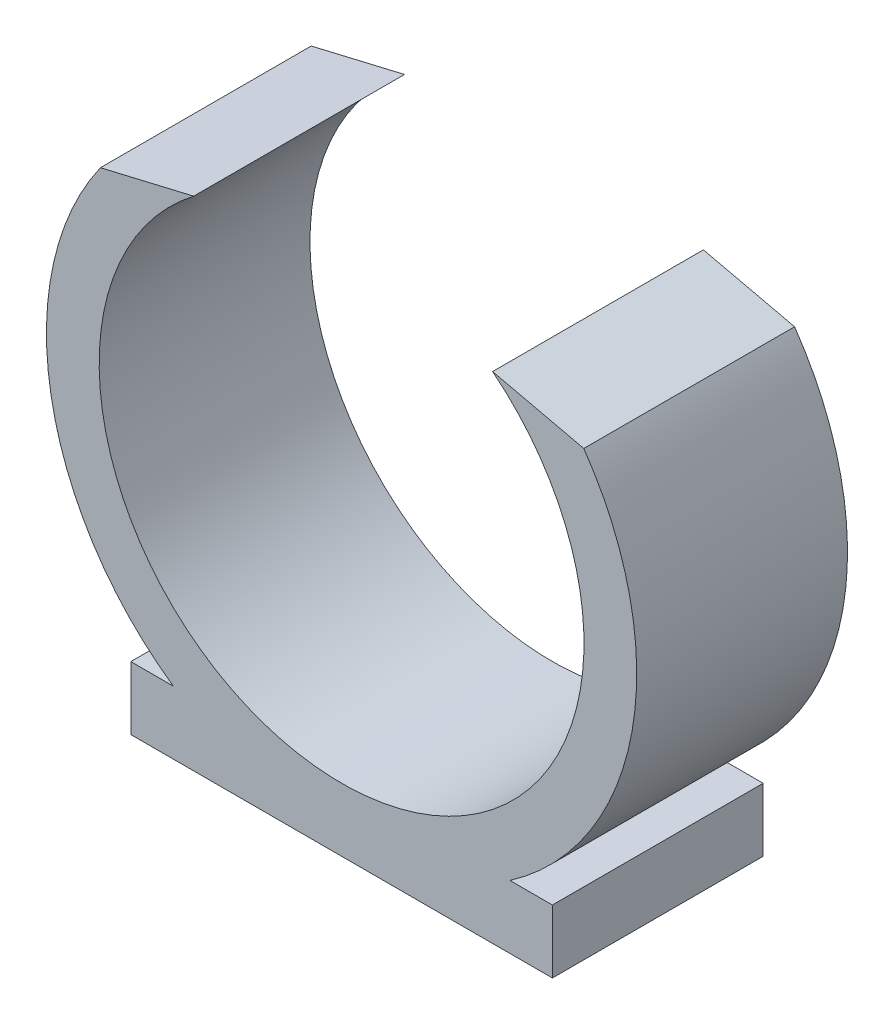
ISO-10303-21;
HEADER;
FILE_DESCRIPTION(('STEP AP214'),'2;1');
FILE_NAME('part.step','',(''),(''),'','','');
FILE_SCHEMA(('AUTOMOTIVE_DESIGN { 1 0 10303 214 1 1 1 1 }'));
ENDSEC;
DATA;
#1=APPLICATION_CONTEXT('core data for automotive mechanical design processes');
#2=APPLICATION_PROTOCOL_DEFINITION('international standard','automotive_design',2000,#1);
#3=PRODUCT_CONTEXT('',#1,'mechanical');
#4=PRODUCT('Part','Part','',(#3));
#5=PRODUCT_RELATED_PRODUCT_CATEGORY('part','',(#4));
#6=PRODUCT_DEFINITION_FORMATION('','',#4);
#7=PRODUCT_DEFINITION_CONTEXT('part definition',#1,'design');
#8=PRODUCT_DEFINITION('design','',#6,#7);
#9=PRODUCT_DEFINITION_SHAPE('','',#8);
#10=(LENGTH_UNIT() NAMED_UNIT(*) SI_UNIT(.MILLI.,.METRE.));
#11=(NAMED_UNIT(*) PLANE_ANGLE_UNIT() SI_UNIT($,.RADIAN.));
#12=(NAMED_UNIT(*) SI_UNIT($,.STERADIAN.) SOLID_ANGLE_UNIT());
#13=UNCERTAINTY_MEASURE_WITH_UNIT(LENGTH_MEASURE(1.E-05),#10,'distance_accuracy_value','');
#14=(GEOMETRIC_REPRESENTATION_CONTEXT(3) GLOBAL_UNCERTAINTY_ASSIGNED_CONTEXT((#13)) GLOBAL_UNIT_ASSIGNED_CONTEXT((#10,
#11,#12)) REPRESENTATION_CONTEXT('',''));
#15=CARTESIAN_POINT('',(0.,0.,0.));
#16=DIRECTION('',(0.,0.,1.));
#17=DIRECTION('',(1.,0.,0.));
#18=AXIS2_PLACEMENT_3D('',#15,#16,#17);
#19=CARTESIAN_POINT('',(0.,0.,5.));
#20=DIRECTION('',(1.,0.,0.));
#21=DIRECTION('',(0.,0.,-1.));
#22=AXIS2_PLACEMENT_3D('',#19,#20,#21);
#23=PLANE('',#22);
#24=DIRECTION('',(0.,-1.,0.));
#25=VECTOR('',#24,1.);
#26=CARTESIAN_POINT('',(0.,0.,0.));
#27=LINE('',#26,#25);
#28=CARTESIAN_POINT('',(0.,1.5,0.));
#29=VERTEX_POINT('',#28);
#30=CARTESIAN_POINT('',(0.,0.,0.));
#31=VERTEX_POINT('',#30);
#32=EDGE_CURVE('E152',#29,#31,#27,.T.);
#33=ORIENTED_EDGE('',*,*,#32,.T.);
#34=DIRECTION('',(0.,0.,-1.));
#35=VECTOR('',#34,1.);
#36=CARTESIAN_POINT('',(0.,0.,5.));
#37=LINE('',#36,#35);
#38=CARTESIAN_POINT('',(0.,0.,5.));
#39=VERTEX_POINT('',#38);
#40=EDGE_CURVE('E11',#39,#31,#37,.T.);
#41=ORIENTED_EDGE('',*,*,#40,.F.);
#42=DIRECTION('',(0.,-1.,0.));
#43=VECTOR('',#42,1.);
#44=CARTESIAN_POINT('',(0.,0.,5.));
#45=LINE('',#44,#43);
#46=CARTESIAN_POINT('',(0.,1.5,5.));
#47=VERTEX_POINT('',#46);
#48=EDGE_CURVE('E180',#47,#39,#45,.T.);
#49=ORIENTED_EDGE('',*,*,#48,.F.);
#50=DIRECTION('',(0.,0.,-1.));
#51=VECTOR('',#50,1.);
#52=CARTESIAN_POINT('',(0.,1.5,5.));
#53=LINE('',#52,#51);
#54=EDGE_CURVE('E148',#47,#29,#53,.T.);
#55=ORIENTED_EDGE('',*,*,#54,.T.);
#56=EDGE_LOOP('',(#33,#41,#49,#55));
#57=FACE_BOUND('',#56,.T.);
#58=ADVANCED_FACE('F39',(#57),#23,.F.);
#59=CARTESIAN_POINT('',(0.,0.,5.));
#60=DIRECTION('',(0.,1.,0.));
#61=DIRECTION('',(0.,0.,1.));
#62=AXIS2_PLACEMENT_3D('',#59,#60,#61);
#63=PLANE('',#62);
#64=DIRECTION('',(1.,0.,0.));
#65=VECTOR('',#64,1.);
#66=CARTESIAN_POINT('',(0.,0.,0.));
#67=LINE('',#66,#65);
#68=CARTESIAN_POINT('',(10.,0.,0.));
#69=VERTEX_POINT('',#68);
#70=EDGE_CURVE('E156',#31,#69,#67,.T.);
#71=ORIENTED_EDGE('',*,*,#70,.T.);
#72=DIRECTION('',(0.,0.,-1.));
#73=VECTOR('',#72,1.);
#74=CARTESIAN_POINT('',(10.,0.,5.));
#75=LINE('',#74,#73);
#76=CARTESIAN_POINT('',(10.,0.,5.));
#77=VERTEX_POINT('',#76);
#78=EDGE_CURVE('E48',#77,#69,#75,.T.);
#79=ORIENTED_EDGE('',*,*,#78,.F.);
#80=DIRECTION('',(1.,0.,0.));
#81=VECTOR('',#80,1.);
#82=CARTESIAN_POINT('',(0.,0.,5.));
#83=LINE('',#82,#81);
#84=EDGE_CURVE('E105',#39,#77,#83,.T.);
#85=ORIENTED_EDGE('',*,*,#84,.F.);
#86=ORIENTED_EDGE('',*,*,#40,.T.);
#87=EDGE_LOOP('',(#71,#79,#85,#86));
#88=FACE_BOUND('',#87,.T.);
#89=ADVANCED_FACE('F244',(#88),#63,.F.);
#90=CARTESIAN_POINT('',(10.,0.,5.));
#91=DIRECTION('',(-1.,0.,0.));
#92=DIRECTION('',(0.,-1.,0.));
#93=AXIS2_PLACEMENT_3D('',#90,#91,#92);
#94=PLANE('',#93);
#95=DIRECTION('',(0.,1.,0.));
#96=VECTOR('',#95,1.);
#97=CARTESIAN_POINT('',(10.,0.,0.));
#98=LINE('',#97,#96);
#99=CARTESIAN_POINT('',(10.,1.5,0.));
#100=VERTEX_POINT('',#99);
#101=EDGE_CURVE('E159',#69,#100,#98,.T.);
#102=ORIENTED_EDGE('',*,*,#101,.T.);
#103=DIRECTION('',(0.,0.,-1.));
#104=VECTOR('',#103,1.);
#105=CARTESIAN_POINT('',(10.,1.5,5.));
#106=LINE('',#105,#104);
#107=CARTESIAN_POINT('',(10.,1.5,5.));
#108=VERTEX_POINT('',#107);
#109=EDGE_CURVE('E199',#108,#100,#106,.T.);
#110=ORIENTED_EDGE('',*,*,#109,.F.);
#111=DIRECTION('',(0.,1.,0.));
#112=VECTOR('',#111,1.);
#113=CARTESIAN_POINT('',(10.,0.,5.));
#114=LINE('',#113,#112);
#115=EDGE_CURVE('E209',#77,#108,#114,.T.);
#116=ORIENTED_EDGE('',*,*,#115,.F.);
#117=ORIENTED_EDGE('',*,*,#78,.T.);
#118=EDGE_LOOP('',(#102,#110,#116,#117));
#119=FACE_BOUND('',#118,.T.);
#120=ADVANCED_FACE('F207',(#119),#94,.F.);
#121=CARTESIAN_POINT('',(8.99217985566783,1.5,5.));
#122=DIRECTION('',(0.,-1.,0.));
#123=DIRECTION('',(1.,0.,0.));
#124=AXIS2_PLACEMENT_3D('',#121,#122,#123);
#125=PLANE('',#124);
#126=DIRECTION('',(-1.,0.,0.));
#127=VECTOR('',#126,1.);
#128=CARTESIAN_POINT('',(8.99217985566783,1.5,0.));
#129=LINE('',#128,#127);
#130=CARTESIAN_POINT('',(8.99217985566783,1.5,0.));
#131=VERTEX_POINT('',#130);
#132=EDGE_CURVE('E162',#100,#131,#129,.T.);
#133=ORIENTED_EDGE('',*,*,#132,.T.);
#134=DIRECTION('',(0.,0.,-1.));
#135=VECTOR('',#134,1.);
#136=CARTESIAN_POINT('',(8.99217985566783,1.5,5.));
#137=LINE('',#136,#135);
#138=CARTESIAN_POINT('',(8.99217985566783,1.5,5.));
#139=VERTEX_POINT('',#138);
#140=EDGE_CURVE('E195',#139,#131,#137,.T.);
#141=ORIENTED_EDGE('',*,*,#140,.F.);
#142=DIRECTION('',(-1.,0.,0.));
#143=VECTOR('',#142,1.);
#144=CARTESIAN_POINT('',(8.99217985566783,1.5,5.));
#145=LINE('',#144,#143);
#146=EDGE_CURVE('E228',#108,#139,#145,.T.);
#147=ORIENTED_EDGE('',*,*,#146,.F.);
#148=ORIENTED_EDGE('',*,*,#109,.T.);
#149=EDGE_LOOP('',(#133,#141,#147,#148));
#150=FACE_BOUND('',#149,.T.);
#151=ADVANCED_FACE('F218',(#150),#125,.F.);
#152=CARTESIAN_POINT('',(5.,7.25,5.));
#153=DIRECTION('',(0.,0.,-1.));
#154=DIRECTION('',(-1.,0.,0.));
#155=AXIS2_PLACEMENT_3D('',#152,#153,#154);
#156=CYLINDRICAL_SURFACE('',#155,7.);
#157=CARTESIAN_POINT('',(5.,7.25,0.));
#158=DIRECTION('',(0.,0.,1.));
#159=DIRECTION('',(1.,0.,0.));
#160=AXIS2_PLACEMENT_3D('',#157,#158,#159);
#161=CIRCLE('',#160,7.);
#162=CARTESIAN_POINT('',(10.7446903327011,11.2498166184677,0.));
#163=VERTEX_POINT('',#162);
#164=EDGE_CURVE('E165',#131,#163,#161,.T.);
#165=ORIENTED_EDGE('',*,*,#164,.T.);
#166=DIRECTION('',(0.,0.,-1.));
#167=VECTOR('',#166,1.);
#168=CARTESIAN_POINT('',(10.7446903327011,11.2498166184677,5.));
#169=LINE('',#168,#167);
#170=CARTESIAN_POINT('',(10.7446903327011,11.2498166184677,5.));
#171=VERTEX_POINT('',#170);
#172=EDGE_CURVE('E191',#171,#163,#169,.T.);
#173=ORIENTED_EDGE('',*,*,#172,.F.);
#174=CARTESIAN_POINT('',(5.,7.25,5.));
#175=DIRECTION('',(0.,0.,1.));
#176=DIRECTION('',(1.,0.,0.));
#177=AXIS2_PLACEMENT_3D('',#174,#175,#176);
#178=CIRCLE('',#177,7.);
#179=EDGE_CURVE('E224',#139,#171,#178,.T.);
#180=ORIENTED_EDGE('',*,*,#179,.F.);
#181=ORIENTED_EDGE('',*,*,#140,.T.);
#182=EDGE_LOOP('',(#165,#173,#180,#181));
#183=FACE_BOUND('',#182,.T.);
#184=ADVANCED_FACE('F222',(#183),#156,.T.);
#185=CARTESIAN_POINT('',(10.7446903327011,11.2498166184677,5.));
#186=DIRECTION('',(-0.224546786897748,-0.974463308952111,0.));
#187=DIRECTION('',(0.974463308952111,-0.224546786897748,0.));
#188=AXIS2_PLACEMENT_3D('',#185,#186,#187);
#189=PLANE('',#188);
#190=DIRECTION('',(-0.974463308952111,0.224546786897748,0.));
#191=VECTOR('',#190,1.);
#192=CARTESIAN_POINT('',(10.7446903327011,11.2498166184677,0.));
#193=LINE('',#192,#191);
#194=CARTESIAN_POINT('',(8.58165826763368,11.7482467755662,0.));
#195=VERTEX_POINT('',#194);
#196=EDGE_CURVE('E168',#163,#195,#193,.T.);
#197=ORIENTED_EDGE('',*,*,#196,.T.);
#198=DIRECTION('',(0.,0.,-1.));
#199=VECTOR('',#198,1.);
#200=CARTESIAN_POINT('',(8.58165826763368,11.7482467755662,5.));
#201=LINE('',#200,#199);
#202=CARTESIAN_POINT('',(8.58165826763368,11.7482467755662,5.));
#203=VERTEX_POINT('',#202);
#204=EDGE_CURVE('E187',#203,#195,#201,.T.);
#205=ORIENTED_EDGE('',*,*,#204,.F.);
#206=DIRECTION('',(-0.974463308952111,0.224546786897748,0.));
#207=VECTOR('',#206,1.);
#208=CARTESIAN_POINT('',(10.7446903327011,11.2498166184677,5.));
#209=LINE('',#208,#207);
#210=EDGE_CURVE('E227',#171,#203,#209,.T.);
#211=ORIENTED_EDGE('',*,*,#210,.F.);
#212=ORIENTED_EDGE('',*,*,#172,.T.);
#213=EDGE_LOOP('',(#197,#205,#211,#212));
#214=FACE_BOUND('',#213,.T.);
#215=ADVANCED_FACE('F256',(#214),#189,.F.);
#216=CARTESIAN_POINT('',(5.,7.25,5.));
#217=DIRECTION('',(0.,0.,-1.));
#218=DIRECTION('',(-1.,0.,0.));
#219=AXIS2_PLACEMENT_3D('',#216,#217,#218);
#220=CYLINDRICAL_SURFACE('',#219,5.75);
#221=CARTESIAN_POINT('',(5.,7.25,0.));
#222=DIRECTION('',(0.,0.,-1.));
#223=DIRECTION('',(1.,0.,0.));
#224=AXIS2_PLACEMENT_3D('',#221,#222,#223);
#225=CIRCLE('',#224,5.75);
#226=CARTESIAN_POINT('',(1.49222454570189,11.8060960659564,0.));
#227=VERTEX_POINT('',#226);
#228=EDGE_CURVE('E171',#195,#227,#225,.T.);
#229=ORIENTED_EDGE('',*,*,#228,.T.);
#230=DIRECTION('',(0.,0.,-1.));
#231=VECTOR('',#230,1.);
#232=CARTESIAN_POINT('',(1.49222454570189,11.8060960659564,5.));
#233=LINE('',#232,#231);
#234=CARTESIAN_POINT('',(1.49222454570189,11.8060960659564,5.));
#235=VERTEX_POINT('',#234);
#236=EDGE_CURVE('E141',#235,#227,#233,.T.);
#237=ORIENTED_EDGE('',*,*,#236,.F.);
#238=CARTESIAN_POINT('',(5.,7.25,5.));
#239=DIRECTION('',(0.,0.,-1.));
#240=DIRECTION('',(1.,0.,0.));
#241=AXIS2_PLACEMENT_3D('',#238,#239,#240);
#242=CIRCLE('',#241,5.75);
#243=EDGE_CURVE('E130',#203,#235,#242,.T.);
#244=ORIENTED_EDGE('',*,*,#243,.F.);
#245=ORIENTED_EDGE('',*,*,#204,.T.);
#246=EDGE_LOOP('',(#229,#237,#244,#245));
#247=FACE_BOUND('',#246,.T.);
#248=ADVANCED_FACE('F259',(#247),#220,.F.);
#249=CARTESIAN_POINT('',(-0.720584593277252,11.2842176330931,5.));
#250=DIRECTION('',(0.229546706811591,-0.97329764686449,0.));
#251=DIRECTION('',(0.97329764686449,0.229546706811591,0.));
#252=AXIS2_PLACEMENT_3D('',#249,#250,#251);
#253=PLANE('',#252);
#254=DIRECTION('',(-0.97329764686449,-0.229546706811591,0.));
#255=VECTOR('',#254,1.);
#256=CARTESIAN_POINT('',(-0.720584593277252,11.2842176330931,0.));
#257=LINE('',#256,#255);
#258=CARTESIAN_POINT('',(-0.720584593277252,11.2842176330931,0.));
#259=VERTEX_POINT('',#258);
#260=EDGE_CURVE('E139',#227,#259,#257,.T.);
#261=ORIENTED_EDGE('',*,*,#260,.T.);
#262=DIRECTION('',(0.,0.,-1.));
#263=VECTOR('',#262,1.);
#264=CARTESIAN_POINT('',(-0.720584593277252,11.2842176330931,5.));
#265=LINE('',#264,#263);
#266=CARTESIAN_POINT('',(-0.720584593277252,11.2842176330931,5.));
#267=VERTEX_POINT('',#266);
#268=EDGE_CURVE('E136',#267,#259,#265,.T.);
#269=ORIENTED_EDGE('',*,*,#268,.F.);
#270=DIRECTION('',(-0.97329764686449,-0.229546706811591,0.));
#271=VECTOR('',#270,1.);
#272=CARTESIAN_POINT('',(-0.720584593277252,11.2842176330931,5.));
#273=LINE('',#272,#271);
#274=EDGE_CURVE('E124',#235,#267,#273,.T.);
#275=ORIENTED_EDGE('',*,*,#274,.F.);
#276=ORIENTED_EDGE('',*,*,#236,.T.);
#277=EDGE_LOOP('',(#261,#269,#275,#276));
#278=FACE_BOUND('',#277,.T.);
#279=ADVANCED_FACE('F137',(#278),#253,.F.);
#280=CARTESIAN_POINT('',(5.,7.25,5.));
#281=DIRECTION('',(0.,0.,-1.));
#282=DIRECTION('',(-1.,0.,0.));
#283=AXIS2_PLACEMENT_3D('',#280,#281,#282);
#284=CYLINDRICAL_SURFACE('',#283,7.);
#285=CARTESIAN_POINT('',(5.,7.25,0.));
#286=DIRECTION('',(0.,0.,1.));
#287=DIRECTION('',(1.,0.,0.));
#288=AXIS2_PLACEMENT_3D('',#285,#286,#287);
#289=CIRCLE('',#288,7.);
#290=CARTESIAN_POINT('',(1.00782014433217,1.5,0.));
#291=VERTEX_POINT('',#290);
#292=EDGE_CURVE('E91',#259,#291,#289,.T.);
#293=ORIENTED_EDGE('',*,*,#292,.T.);
#294=DIRECTION('',(0.,0.,-1.));
#295=VECTOR('',#294,1.);
#296=CARTESIAN_POINT('',(1.00782014433217,1.5,5.));
#297=LINE('',#296,#295);
#298=CARTESIAN_POINT('',(1.00782014433217,1.5,5.));
#299=VERTEX_POINT('',#298);
#300=EDGE_CURVE('E142',#299,#291,#297,.T.);
#301=ORIENTED_EDGE('',*,*,#300,.F.);
#302=CARTESIAN_POINT('',(5.,7.25,5.));
#303=DIRECTION('',(0.,0.,1.));
#304=DIRECTION('',(1.,0.,0.));
#305=AXIS2_PLACEMENT_3D('',#302,#303,#304);
#306=CIRCLE('',#305,7.);
#307=EDGE_CURVE('E128',#267,#299,#306,.T.);
#308=ORIENTED_EDGE('',*,*,#307,.F.);
#309=ORIENTED_EDGE('',*,*,#268,.T.);
#310=EDGE_LOOP('',(#293,#301,#308,#309));
#311=FACE_BOUND('',#310,.T.);
#312=ADVANCED_FACE('F144',(#311),#284,.T.);
#313=CARTESIAN_POINT('',(0.,1.5,5.));
#314=DIRECTION('',(0.,-1.,0.));
#315=DIRECTION('',(0.,0.,-1.));
#316=AXIS2_PLACEMENT_3D('',#313,#314,#315);
#317=PLANE('',#316);
#318=DIRECTION('',(-1.,0.,0.));
#319=VECTOR('',#318,1.);
#320=CARTESIAN_POINT('',(0.,1.5,0.));
#321=LINE('',#320,#319);
#322=EDGE_CURVE('E97',#291,#29,#321,.T.);
#323=ORIENTED_EDGE('',*,*,#322,.T.);
#324=ORIENTED_EDGE('',*,*,#54,.F.);
#325=DIRECTION('',(-1.,0.,0.));
#326=VECTOR('',#325,1.);
#327=CARTESIAN_POINT('',(0.,1.5,5.));
#328=LINE('',#327,#326);
#329=EDGE_CURVE('E56',#299,#47,#328,.T.);
#330=ORIENTED_EDGE('',*,*,#329,.F.);
#331=ORIENTED_EDGE('',*,*,#300,.T.);
#332=EDGE_LOOP('',(#323,#324,#330,#331));
#333=FACE_BOUND('',#332,.T.);
#334=ADVANCED_FACE('F268',(#333),#317,.F.);
#335=CARTESIAN_POINT('',(5.,7.25,5.));
#336=DIRECTION('',(0.,0.,1.));
#337=DIRECTION('',(1.,0.,0.));
#338=AXIS2_PLACEMENT_3D('',#335,#336,#337);
#339=PLANE('',#338);
#340=ORIENTED_EDGE('',*,*,#48,.T.);
#341=ORIENTED_EDGE('',*,*,#84,.T.);
#342=ORIENTED_EDGE('',*,*,#115,.T.);
#343=ORIENTED_EDGE('',*,*,#146,.T.);
#344=ORIENTED_EDGE('',*,*,#179,.T.);
#345=ORIENTED_EDGE('',*,*,#210,.T.);
#346=ORIENTED_EDGE('',*,*,#243,.T.);
#347=ORIENTED_EDGE('',*,*,#274,.T.);
#348=ORIENTED_EDGE('',*,*,#307,.T.);
#349=ORIENTED_EDGE('',*,*,#329,.T.);
#350=EDGE_LOOP('',(#340,#341,#342,#343,#344,#345,#346,#347,#348,#349));
#351=FACE_BOUND('',#350,.T.);
#352=ADVANCED_FACE('F126',(#351),#339,.T.);
#353=CARTESIAN_POINT('',(5.,7.25,0.));
#354=DIRECTION('',(0.,0.,1.));
#355=DIRECTION('',(1.,0.,0.));
#356=AXIS2_PLACEMENT_3D('',#353,#354,#355);
#357=PLANE('',#356);
#358=ORIENTED_EDGE('',*,*,#32,.F.);
#359=ORIENTED_EDGE('',*,*,#322,.F.);
#360=ORIENTED_EDGE('',*,*,#292,.F.);
#361=ORIENTED_EDGE('',*,*,#260,.F.);
#362=ORIENTED_EDGE('',*,*,#228,.F.);
#363=ORIENTED_EDGE('',*,*,#196,.F.);
#364=ORIENTED_EDGE('',*,*,#164,.F.);
#365=ORIENTED_EDGE('',*,*,#132,.F.);
#366=ORIENTED_EDGE('',*,*,#101,.F.);
#367=ORIENTED_EDGE('',*,*,#70,.F.);
#368=EDGE_LOOP('',(#358,#359,#360,#361,#362,#363,#364,#365,#366,#367));
#369=FACE_BOUND('',#368,.T.);
#370=ADVANCED_FACE('F213',(#369),#357,.F.);
#371=CLOSED_SHELL('',(#58,#89,#120,#151,#184,#215,#248,#279,#312,#334,#352,#370));
#372=MANIFOLD_SOLID_BREP('B2',#371);
#373=ADVANCED_BREP_SHAPE_REPRESENTATION('',(#18,#372),#14);
#374=SHAPE_DEFINITION_REPRESENTATION(#9,#373);
ENDSEC;
END-ISO-10303-21;
